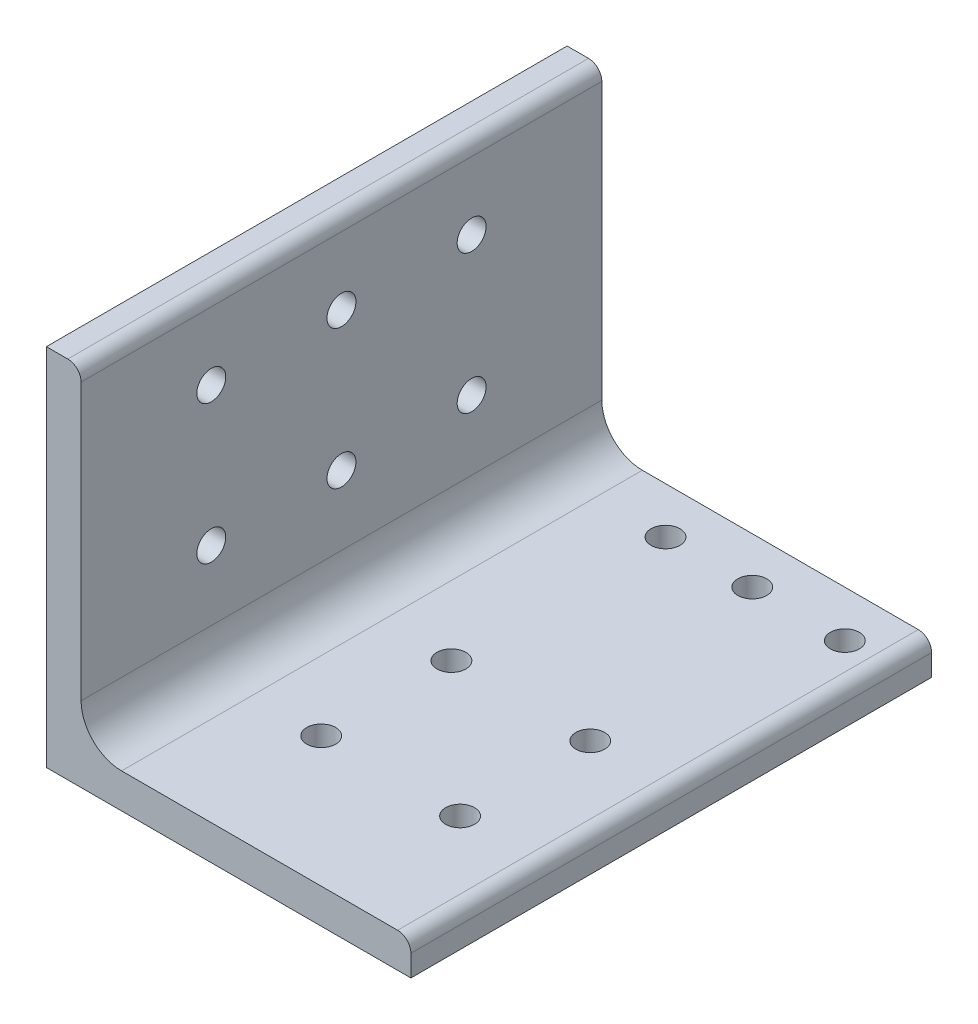
ISO-10303-21;
HEADER;
FILE_DESCRIPTION(('STEP AP214'),'2;1');
FILE_NAME('part.step','',(''),(''),'','','');
FILE_SCHEMA(('AUTOMOTIVE_DESIGN { 1 0 10303 214 1 1 1 1 }'));
ENDSEC;
DATA;
#1=APPLICATION_CONTEXT('core data for automotive mechanical design processes');
#2=APPLICATION_PROTOCOL_DEFINITION('international standard','automotive_design',2000,#1);
#3=PRODUCT_CONTEXT('',#1,'mechanical');
#4=PRODUCT('Part','Part','',(#3));
#5=PRODUCT_RELATED_PRODUCT_CATEGORY('part','',(#4));
#6=PRODUCT_DEFINITION_FORMATION('','',#4);
#7=PRODUCT_DEFINITION_CONTEXT('part definition',#1,'design');
#8=PRODUCT_DEFINITION('design','',#6,#7);
#9=PRODUCT_DEFINITION_SHAPE('','',#8);
#10=(LENGTH_UNIT() NAMED_UNIT(*) SI_UNIT(.MILLI.,.METRE.));
#11=(NAMED_UNIT(*) PLANE_ANGLE_UNIT() SI_UNIT($,.RADIAN.));
#12=(NAMED_UNIT(*) SI_UNIT($,.STERADIAN.) SOLID_ANGLE_UNIT());
#13=UNCERTAINTY_MEASURE_WITH_UNIT(LENGTH_MEASURE(1.E-05),#10,'distance_accuracy_value','');
#14=(GEOMETRIC_REPRESENTATION_CONTEXT(3) GLOBAL_UNCERTAINTY_ASSIGNED_CONTEXT((#13)) GLOBAL_UNIT_ASSIGNED_CONTEXT((#10,
#11,#12)) REPRESENTATION_CONTEXT('',''));
#15=CARTESIAN_POINT('',(0.,0.,0.));
#16=DIRECTION('',(0.,0.,1.));
#17=DIRECTION('',(1.,0.,0.));
#18=AXIS2_PLACEMENT_3D('',#15,#16,#17);
#19=CARTESIAN_POINT('',(0.,0.,90.));
#20=DIRECTION('',(-1.,0.,0.));
#21=DIRECTION('',(0.,0.,1.));
#22=AXIS2_PLACEMENT_3D('',#19,#20,#21);
#23=PLANE('',#22);
#24=CARTESIAN_POINT('',(0.,25.,67.5));
#25=DIRECTION('',(1.,0.,0.));
#26=DIRECTION('',(0.,0.,-1.));
#27=AXIS2_PLACEMENT_3D('',#24,#25,#26);
#28=CIRCLE('',#27,2.5);
#29=CARTESIAN_POINT('',(0.,25.,65.));
#30=VERTEX_POINT('',#29);
#31=EDGE_CURVE('E295',#30,#30,#28,.T.);
#32=ORIENTED_EDGE('',*,*,#31,.T.);
#33=EDGE_LOOP('',(#32));
#34=FACE_BOUND('',#33,.T.);
#35=CARTESIAN_POINT('',(0.,49.,45.));
#36=DIRECTION('',(1.,0.,0.));
#37=DIRECTION('',(0.,0.,-1.));
#38=AXIS2_PLACEMENT_3D('',#35,#36,#37);
#39=CIRCLE('',#38,2.5);
#40=CARTESIAN_POINT('',(0.,49.,42.5));
#41=VERTEX_POINT('',#40);
#42=EDGE_CURVE('E307',#41,#41,#39,.T.);
#43=ORIENTED_EDGE('',*,*,#42,.T.);
#44=EDGE_LOOP('',(#43));
#45=FACE_BOUND('',#44,.T.);
#46=CARTESIAN_POINT('',(0.,25.,45.));
#47=DIRECTION('',(1.,0.,0.));
#48=DIRECTION('',(0.,0.,-1.));
#49=AXIS2_PLACEMENT_3D('',#46,#47,#48);
#50=CIRCLE('',#49,2.5);
#51=CARTESIAN_POINT('',(0.,25.,42.5));
#52=VERTEX_POINT('',#51);
#53=EDGE_CURVE('E311',#52,#52,#50,.T.);
#54=ORIENTED_EDGE('',*,*,#53,.T.);
#55=EDGE_LOOP('',(#54));
#56=FACE_BOUND('',#55,.T.);
#57=CARTESIAN_POINT('',(0.,25.,22.5));
#58=DIRECTION('',(1.,0.,0.));
#59=DIRECTION('',(0.,0.,-1.));
#60=AXIS2_PLACEMENT_3D('',#57,#58,#59);
#61=CIRCLE('',#60,2.5);
#62=CARTESIAN_POINT('',(0.,25.,20.));
#63=VERTEX_POINT('',#62);
#64=EDGE_CURVE('E238',#63,#63,#61,.T.);
#65=ORIENTED_EDGE('',*,*,#64,.T.);
#66=EDGE_LOOP('',(#65));
#67=FACE_BOUND('',#66,.T.);
#68=CARTESIAN_POINT('',(0.,49.,22.5000000000001));
#69=DIRECTION('',(1.,0.,0.));
#70=DIRECTION('',(0.,0.,-1.));
#71=AXIS2_PLACEMENT_3D('',#68,#69,#70);
#72=CIRCLE('',#71,2.5);
#73=CARTESIAN_POINT('',(0.,49.,20.0000000000001));
#74=VERTEX_POINT('',#73);
#75=EDGE_CURVE('E136',#74,#74,#72,.T.);
#76=ORIENTED_EDGE('',*,*,#75,.T.);
#77=EDGE_LOOP('',(#76));
#78=FACE_BOUND('',#77,.T.);
#79=DIRECTION('',(0.,1.,0.));
#80=VECTOR('',#79,1.);
#81=CARTESIAN_POINT('',(0.,0.,0.));
#82=LINE('',#81,#80);
#83=CARTESIAN_POINT('',(0.,0.,0.));
#84=VERTEX_POINT('',#83);
#85=CARTESIAN_POINT('',(0.,63.,0.));
#86=VERTEX_POINT('',#85);
#87=EDGE_CURVE('E145',#84,#86,#82,.T.);
#88=ORIENTED_EDGE('',*,*,#87,.F.);
#89=DIRECTION('',(0.,0.,-1.));
#90=VECTOR('',#89,1.);
#91=CARTESIAN_POINT('',(0.,0.,90.));
#92=LINE('',#91,#90);
#93=CARTESIAN_POINT('',(0.,0.,90.));
#94=VERTEX_POINT('',#93);
#95=EDGE_CURVE('E160',#94,#84,#92,.T.);
#96=ORIENTED_EDGE('',*,*,#95,.F.);
#97=DIRECTION('',(0.,1.,0.));
#98=VECTOR('',#97,1.);
#99=CARTESIAN_POINT('',(0.,0.,90.));
#100=LINE('',#99,#98);
#101=CARTESIAN_POINT('',(0.,63.,90.));
#102=VERTEX_POINT('',#101);
#103=EDGE_CURVE('E252',#94,#102,#100,.T.);
#104=ORIENTED_EDGE('',*,*,#103,.T.);
#105=DIRECTION('',(0.,0.,-1.));
#106=VECTOR('',#105,1.);
#107=CARTESIAN_POINT('',(0.,63.,90.));
#108=LINE('',#107,#106);
#109=EDGE_CURVE('E162',#102,#86,#108,.T.);
#110=ORIENTED_EDGE('',*,*,#109,.T.);
#111=EDGE_LOOP('',(#88,#96,#104,#110));
#112=FACE_BOUND('',#111,.T.);
#113=CARTESIAN_POINT('',(0.,49.,67.5));
#114=DIRECTION('',(1.,0.,0.));
#115=DIRECTION('',(0.,0.,-1.));
#116=AXIS2_PLACEMENT_3D('',#113,#114,#115);
#117=CIRCLE('',#116,2.5);
#118=CARTESIAN_POINT('',(0.,49.,65.));
#119=VERTEX_POINT('',#118);
#120=EDGE_CURVE('E303',#119,#119,#117,.T.);
#121=ORIENTED_EDGE('',*,*,#120,.T.);
#122=EDGE_LOOP('',(#121));
#123=FACE_BOUND('',#122,.T.);
#124=ADVANCED_FACE('F32',(#34,#45,#56,#67,#78,#112,#123),#23,.T.);
#125=CARTESIAN_POINT('',(13.,13.,90.));
#126=DIRECTION('',(0.,0.,-1.));
#127=DIRECTION('',(-1.,0.,0.));
#128=AXIS2_PLACEMENT_3D('',#125,#126,#127);
#129=CYLINDRICAL_SURFACE('',#128,7.);
#130=CARTESIAN_POINT('',(13.,13.,0.));
#131=DIRECTION('',(0.,0.,1.));
#132=DIRECTION('',(1.,0.,0.));
#133=AXIS2_PLACEMENT_3D('',#130,#131,#132);
#134=CIRCLE('',#133,7.);
#135=CARTESIAN_POINT('',(6.,13.,0.));
#136=VERTEX_POINT('',#135);
#137=CARTESIAN_POINT('',(13.,6.,0.));
#138=VERTEX_POINT('',#137);
#139=EDGE_CURVE('E133',#136,#138,#134,.T.);
#140=ORIENTED_EDGE('',*,*,#139,.F.);
#141=DIRECTION('',(0.,0.,-1.));
#142=VECTOR('',#141,1.);
#143=CARTESIAN_POINT('',(6.,13.,90.));
#144=LINE('',#143,#142);
#145=CARTESIAN_POINT('',(6.,13.,90.));
#146=VERTEX_POINT('',#145);
#147=EDGE_CURVE('E11',#146,#136,#144,.T.);
#148=ORIENTED_EDGE('',*,*,#147,.F.);
#149=CARTESIAN_POINT('',(13.,13.,90.));
#150=DIRECTION('',(0.,0.,1.));
#151=DIRECTION('',(1.,0.,0.));
#152=AXIS2_PLACEMENT_3D('',#149,#150,#151);
#153=CIRCLE('',#152,7.);
#154=CARTESIAN_POINT('',(13.,6.,90.));
#155=VERTEX_POINT('',#154);
#156=EDGE_CURVE('E156',#146,#155,#153,.T.);
#157=ORIENTED_EDGE('',*,*,#156,.T.);
#158=DIRECTION('',(0.,0.,-1.));
#159=VECTOR('',#158,1.);
#160=CARTESIAN_POINT('',(13.,6.,90.));
#161=LINE('',#160,#159);
#162=EDGE_CURVE('E49',#155,#138,#161,.T.);
#163=ORIENTED_EDGE('',*,*,#162,.T.);
#164=EDGE_LOOP('',(#140,#148,#157,#163));
#165=FACE_BOUND('',#164,.T.);
#166=ADVANCED_FACE('F34',(#165),#129,.F.);
#167=CARTESIAN_POINT('',(6.,0.,90.));
#168=DIRECTION('',(1.,0.,0.));
#169=DIRECTION('',(0.,1.,0.));
#170=AXIS2_PLACEMENT_3D('',#167,#168,#169);
#171=PLANE('',#170);
#172=CARTESIAN_POINT('',(6.,25.,67.5));
#173=DIRECTION('',(1.,0.,0.));
#174=DIRECTION('',(0.,0.,-1.));
#175=AXIS2_PLACEMENT_3D('',#172,#173,#174);
#176=CIRCLE('',#175,2.5);
#177=CARTESIAN_POINT('',(6.,25.,65.));
#178=VERTEX_POINT('',#177);
#179=EDGE_CURVE('E217',#178,#178,#176,.T.);
#180=ORIENTED_EDGE('',*,*,#179,.F.);
#181=EDGE_LOOP('',(#180));
#182=FACE_BOUND('',#181,.T.);
#183=CARTESIAN_POINT('',(6.,49.,67.5));
#184=DIRECTION('',(1.,0.,0.));
#185=DIRECTION('',(0.,0.,-1.));
#186=AXIS2_PLACEMENT_3D('',#183,#184,#185);
#187=CIRCLE('',#186,2.5);
#188=CARTESIAN_POINT('',(6.,49.,65.));
#189=VERTEX_POINT('',#188);
#190=EDGE_CURVE('E221',#189,#189,#187,.T.);
#191=ORIENTED_EDGE('',*,*,#190,.F.);
#192=EDGE_LOOP('',(#191));
#193=FACE_BOUND('',#192,.T.);
#194=CARTESIAN_POINT('',(6.,49.,45.));
#195=DIRECTION('',(1.,0.,0.));
#196=DIRECTION('',(0.,0.,-1.));
#197=AXIS2_PLACEMENT_3D('',#194,#195,#196);
#198=CIRCLE('',#197,2.5);
#199=CARTESIAN_POINT('',(6.,49.,42.5));
#200=VERTEX_POINT('',#199);
#201=EDGE_CURVE('E225',#200,#200,#198,.T.);
#202=ORIENTED_EDGE('',*,*,#201,.F.);
#203=EDGE_LOOP('',(#202));
#204=FACE_BOUND('',#203,.T.);
#205=CARTESIAN_POINT('',(6.,25.,45.));
#206=DIRECTION('',(1.,0.,0.));
#207=DIRECTION('',(0.,0.,-1.));
#208=AXIS2_PLACEMENT_3D('',#205,#206,#207);
#209=CIRCLE('',#208,2.5);
#210=CARTESIAN_POINT('',(6.,25.,42.5));
#211=VERTEX_POINT('',#210);
#212=EDGE_CURVE('E229',#211,#211,#209,.T.);
#213=ORIENTED_EDGE('',*,*,#212,.F.);
#214=EDGE_LOOP('',(#213));
#215=FACE_BOUND('',#214,.T.);
#216=CARTESIAN_POINT('',(6.,25.,22.5));
#217=DIRECTION('',(1.,0.,0.));
#218=DIRECTION('',(0.,0.,-1.));
#219=AXIS2_PLACEMENT_3D('',#216,#217,#218);
#220=CIRCLE('',#219,2.5);
#221=CARTESIAN_POINT('',(6.,25.,20.));
#222=VERTEX_POINT('',#221);
#223=EDGE_CURVE('E233',#222,#222,#220,.T.);
#224=ORIENTED_EDGE('',*,*,#223,.F.);
#225=EDGE_LOOP('',(#224));
#226=FACE_BOUND('',#225,.T.);
#227=CARTESIAN_POINT('',(6.,49.,22.5000000000001));
#228=DIRECTION('',(1.,0.,0.));
#229=DIRECTION('',(0.,0.,-1.));
#230=AXIS2_PLACEMENT_3D('',#227,#228,#229);
#231=CIRCLE('',#230,2.5);
#232=CARTESIAN_POINT('',(6.,49.,20.0000000000001));
#233=VERTEX_POINT('',#232);
#234=EDGE_CURVE('E236',#233,#233,#231,.T.);
#235=ORIENTED_EDGE('',*,*,#234,.F.);
#236=EDGE_LOOP('',(#235));
#237=FACE_BOUND('',#236,.T.);
#238=DIRECTION('',(0.,-1.,0.));
#239=VECTOR('',#238,1.);
#240=CARTESIAN_POINT('',(6.,0.,0.));
#241=LINE('',#240,#239);
#242=CARTESIAN_POINT('',(6.,60.7,0.));
#243=VERTEX_POINT('',#242);
#244=EDGE_CURVE('E135',#243,#136,#241,.T.);
#245=ORIENTED_EDGE('',*,*,#244,.F.);
#246=DIRECTION('',(0.,0.,-1.));
#247=VECTOR('',#246,1.);
#248=CARTESIAN_POINT('',(6.,60.7,90.));
#249=LINE('',#248,#247);
#250=CARTESIAN_POINT('',(6.,60.7,90.));
#251=VERTEX_POINT('',#250);
#252=EDGE_CURVE('E41',#251,#243,#249,.T.);
#253=ORIENTED_EDGE('',*,*,#252,.F.);
#254=DIRECTION('',(0.,-1.,0.));
#255=VECTOR('',#254,1.);
#256=CARTESIAN_POINT('',(6.,0.,90.));
#257=LINE('',#256,#255);
#258=EDGE_CURVE('E179',#251,#146,#257,.T.);
#259=ORIENTED_EDGE('',*,*,#258,.T.);
#260=ORIENTED_EDGE('',*,*,#147,.T.);
#261=EDGE_LOOP('',(#245,#253,#259,#260));
#262=FACE_BOUND('',#261,.T.);
#263=ADVANCED_FACE('F178',(#182,#193,#204,#215,#226,#237,#262),#171,.T.);
#264=CARTESIAN_POINT('',(3.7,60.7,90.));
#265=DIRECTION('',(0.,0.,-1.));
#266=DIRECTION('',(-1.,0.,0.));
#267=AXIS2_PLACEMENT_3D('',#264,#265,#266);
#268=CYLINDRICAL_SURFACE('',#267,2.3);
#269=CARTESIAN_POINT('',(3.7,60.7,0.));
#270=DIRECTION('',(0.,0.,1.));
#271=DIRECTION('',(1.,0.,0.));
#272=AXIS2_PLACEMENT_3D('',#269,#270,#271);
#273=CIRCLE('',#272,2.3);
#274=CARTESIAN_POINT('',(3.69999999999999,63.,0.));
#275=VERTEX_POINT('',#274);
#276=EDGE_CURVE('E139',#243,#275,#273,.T.);
#277=ORIENTED_EDGE('',*,*,#276,.T.);
#278=DIRECTION('',(0.,0.,-1.));
#279=VECTOR('',#278,1.);
#280=CARTESIAN_POINT('',(3.69999999999999,63.,90.));
#281=LINE('',#280,#279);
#282=CARTESIAN_POINT('',(3.69999999999999,63.,90.));
#283=VERTEX_POINT('',#282);
#284=EDGE_CURVE('E164',#283,#275,#281,.T.);
#285=ORIENTED_EDGE('',*,*,#284,.F.);
#286=CARTESIAN_POINT('',(3.7,60.7,90.));
#287=DIRECTION('',(0.,0.,1.));
#288=DIRECTION('',(1.,0.,0.));
#289=AXIS2_PLACEMENT_3D('',#286,#287,#288);
#290=CIRCLE('',#289,2.3);
#291=EDGE_CURVE('E170',#251,#283,#290,.T.);
#292=ORIENTED_EDGE('',*,*,#291,.F.);
#293=ORIENTED_EDGE('',*,*,#252,.T.);
#294=EDGE_LOOP('',(#277,#285,#292,#293));
#295=FACE_BOUND('',#294,.T.);
#296=ADVANCED_FACE('F168',(#295),#268,.T.);
#297=CARTESIAN_POINT('',(0.,63.,90.));
#298=DIRECTION('',(0.,1.,0.));
#299=DIRECTION('',(0.,0.,1.));
#300=AXIS2_PLACEMENT_3D('',#297,#298,#299);
#301=PLANE('',#300);
#302=DIRECTION('',(1.,0.,0.));
#303=VECTOR('',#302,1.);
#304=CARTESIAN_POINT('',(0.,63.,0.));
#305=LINE('',#304,#303);
#306=EDGE_CURVE('E142',#86,#275,#305,.T.);
#307=ORIENTED_EDGE('',*,*,#306,.F.);
#308=ORIENTED_EDGE('',*,*,#109,.F.);
#309=DIRECTION('',(1.,0.,0.));
#310=VECTOR('',#309,1.);
#311=CARTESIAN_POINT('',(0.,63.,90.));
#312=LINE('',#311,#310);
#313=EDGE_CURVE('E249',#102,#283,#312,.T.);
#314=ORIENTED_EDGE('',*,*,#313,.T.);
#315=ORIENTED_EDGE('',*,*,#284,.T.);
#316=EDGE_LOOP('',(#307,#308,#314,#315));
#317=FACE_BOUND('',#316,.T.);
#318=ADVANCED_FACE('F205',(#317),#301,.T.);
#319=CARTESIAN_POINT('',(0.,0.,90.));
#320=DIRECTION('',(0.,1.,0.));
#321=DIRECTION('',(0.,0.,1.));
#322=AXIS2_PLACEMENT_3D('',#319,#320,#321);
#323=PLANE('',#322);
#324=CARTESIAN_POINT('',(49.,0.,67.5));
#325=DIRECTION('',(0.,1.,0.));
#326=DIRECTION('',(0.,0.,1.));
#327=AXIS2_PLACEMENT_3D('',#324,#325,#326);
#328=CIRCLE('',#327,2.5);
#329=CARTESIAN_POINT('',(49.,0.,70.));
#330=VERTEX_POINT('',#329);
#331=EDGE_CURVE('E268',#330,#330,#328,.T.);
#332=ORIENTED_EDGE('',*,*,#331,.T.);
#333=EDGE_LOOP('',(#332));
#334=FACE_BOUND('',#333,.T.);
#335=CARTESIAN_POINT('',(49.,0.,45.));
#336=DIRECTION('',(0.,1.,0.));
#337=DIRECTION('',(0.,0.,1.));
#338=AXIS2_PLACEMENT_3D('',#335,#336,#337);
#339=CIRCLE('',#338,2.5);
#340=CARTESIAN_POINT('',(49.,0.,47.5));
#341=VERTEX_POINT('',#340);
#342=EDGE_CURVE('E272',#341,#341,#339,.T.);
#343=ORIENTED_EDGE('',*,*,#342,.T.);
#344=EDGE_LOOP('',(#343));
#345=FACE_BOUND('',#344,.T.);
#346=CARTESIAN_POINT('',(25.,0.,45.));
#347=DIRECTION('',(0.,1.,0.));
#348=DIRECTION('',(0.,0.,1.));
#349=AXIS2_PLACEMENT_3D('',#346,#347,#348);
#350=CIRCLE('',#349,2.5);
#351=CARTESIAN_POINT('',(25.,0.,47.5));
#352=VERTEX_POINT('',#351);
#353=EDGE_CURVE('E276',#352,#352,#350,.T.);
#354=ORIENTED_EDGE('',*,*,#353,.T.);
#355=EDGE_LOOP('',(#354));
#356=FACE_BOUND('',#355,.T.);
#357=CARTESIAN_POINT('',(25.,0.,67.5));
#358=DIRECTION('',(0.,1.,0.));
#359=DIRECTION('',(0.,0.,1.));
#360=AXIS2_PLACEMENT_3D('',#357,#358,#359);
#361=CIRCLE('',#360,2.5);
#362=CARTESIAN_POINT('',(25.,0.,70.));
#363=VERTEX_POINT('',#362);
#364=EDGE_CURVE('E280',#363,#363,#361,.T.);
#365=ORIENTED_EDGE('',*,*,#364,.T.);
#366=EDGE_LOOP('',(#365));
#367=FACE_BOUND('',#366,.T.);
#368=CARTESIAN_POINT('',(25.,0.,8.));
#369=DIRECTION('',(0.,1.,0.));
#370=DIRECTION('',(0.,0.,1.));
#371=AXIS2_PLACEMENT_3D('',#368,#369,#370);
#372=CIRCLE('',#371,2.5);
#373=CARTESIAN_POINT('',(25.,0.,10.5));
#374=VERTEX_POINT('',#373);
#375=EDGE_CURVE('E284',#374,#374,#372,.T.);
#376=ORIENTED_EDGE('',*,*,#375,.T.);
#377=EDGE_LOOP('',(#376));
#378=FACE_BOUND('',#377,.T.);
#379=CARTESIAN_POINT('',(40.,0.,8.));
#380=DIRECTION('',(0.,1.,0.));
#381=DIRECTION('',(0.,0.,1.));
#382=AXIS2_PLACEMENT_3D('',#379,#380,#381);
#383=CIRCLE('',#382,2.5);
#384=CARTESIAN_POINT('',(40.,0.,10.5));
#385=VERTEX_POINT('',#384);
#386=EDGE_CURVE('E288',#385,#385,#383,.T.);
#387=ORIENTED_EDGE('',*,*,#386,.T.);
#388=EDGE_LOOP('',(#387));
#389=FACE_BOUND('',#388,.T.);
#390=CARTESIAN_POINT('',(56.,0.,8.));
#391=DIRECTION('',(0.,1.,0.));
#392=DIRECTION('',(0.,0.,1.));
#393=AXIS2_PLACEMENT_3D('',#390,#391,#392);
#394=CIRCLE('',#393,2.5);
#395=CARTESIAN_POINT('',(56.,0.,10.5));
#396=VERTEX_POINT('',#395);
#397=EDGE_CURVE('E291',#396,#396,#394,.T.);
#398=ORIENTED_EDGE('',*,*,#397,.T.);
#399=EDGE_LOOP('',(#398));
#400=FACE_BOUND('',#399,.T.);
#401=DIRECTION('',(1.,0.,0.));
#402=VECTOR('',#401,1.);
#403=CARTESIAN_POINT('',(0.,0.,0.));
#404=LINE('',#403,#402);
#405=CARTESIAN_POINT('',(63.,0.,0.));
#406=VERTEX_POINT('',#405);
#407=EDGE_CURVE('E148',#84,#406,#404,.T.);
#408=ORIENTED_EDGE('',*,*,#407,.T.);
#409=DIRECTION('',(0.,0.,-1.));
#410=VECTOR('',#409,1.);
#411=CARTESIAN_POINT('',(63.,0.,90.));
#412=LINE('',#411,#410);
#413=CARTESIAN_POINT('',(63.,0.,90.));
#414=VERTEX_POINT('',#413);
#415=EDGE_CURVE('E125',#414,#406,#412,.T.);
#416=ORIENTED_EDGE('',*,*,#415,.F.);
#417=DIRECTION('',(1.,0.,0.));
#418=VECTOR('',#417,1.);
#419=CARTESIAN_POINT('',(0.,0.,90.));
#420=LINE('',#419,#418);
#421=EDGE_CURVE('E113',#94,#414,#420,.T.);
#422=ORIENTED_EDGE('',*,*,#421,.F.);
#423=ORIENTED_EDGE('',*,*,#95,.T.);
#424=EDGE_LOOP('',(#408,#416,#422,#423));
#425=FACE_BOUND('',#424,.T.);
#426=ADVANCED_FACE('F203',(#334,#345,#356,#367,#378,#389,#400,#425),#323,.F.);
#427=CARTESIAN_POINT('',(63.,0.,90.));
#428=DIRECTION('',(-1.,0.,0.));
#429=DIRECTION('',(0.,0.,1.));
#430=AXIS2_PLACEMENT_3D('',#427,#428,#429);
#431=PLANE('',#430);
#432=DIRECTION('',(0.,1.,0.));
#433=VECTOR('',#432,1.);
#434=CARTESIAN_POINT('',(63.,0.,0.));
#435=LINE('',#434,#433);
#436=CARTESIAN_POINT('',(63.,3.69999999999998,0.));
#437=VERTEX_POINT('',#436);
#438=EDGE_CURVE('E122',#406,#437,#435,.T.);
#439=ORIENTED_EDGE('',*,*,#438,.T.);
#440=DIRECTION('',(0.,0.,-1.));
#441=VECTOR('',#440,1.);
#442=CARTESIAN_POINT('',(63.,3.69999999999998,90.));
#443=LINE('',#442,#441);
#444=CARTESIAN_POINT('',(63.,3.69999999999998,90.));
#445=VERTEX_POINT('',#444);
#446=EDGE_CURVE('E119',#445,#437,#443,.T.);
#447=ORIENTED_EDGE('',*,*,#446,.F.);
#448=DIRECTION('',(0.,1.,0.));
#449=VECTOR('',#448,1.);
#450=CARTESIAN_POINT('',(63.,0.,90.));
#451=LINE('',#450,#449);
#452=EDGE_CURVE('E105',#414,#445,#451,.T.);
#453=ORIENTED_EDGE('',*,*,#452,.F.);
#454=ORIENTED_EDGE('',*,*,#415,.T.);
#455=EDGE_LOOP('',(#439,#447,#453,#454));
#456=FACE_BOUND('',#455,.T.);
#457=ADVANCED_FACE('F120',(#456),#431,.F.);
#458=CARTESIAN_POINT('',(60.7,3.7,90.));
#459=DIRECTION('',(0.,0.,-1.));
#460=DIRECTION('',(-1.,0.,0.));
#461=AXIS2_PLACEMENT_3D('',#458,#459,#460);
#462=CYLINDRICAL_SURFACE('',#461,2.3);
#463=CARTESIAN_POINT('',(60.7,3.7,0.));
#464=DIRECTION('',(0.,0.,1.));
#465=DIRECTION('',(1.,0.,0.));
#466=AXIS2_PLACEMENT_3D('',#463,#464,#465);
#467=CIRCLE('',#466,2.3);
#468=CARTESIAN_POINT('',(60.7,6.,0.));
#469=VERTEX_POINT('',#468);
#470=EDGE_CURVE('E151',#437,#469,#467,.T.);
#471=ORIENTED_EDGE('',*,*,#470,.T.);
#472=DIRECTION('',(0.,0.,-1.));
#473=VECTOR('',#472,1.);
#474=CARTESIAN_POINT('',(60.7,6.,90.));
#475=LINE('',#474,#473);
#476=CARTESIAN_POINT('',(60.7,6.,90.));
#477=VERTEX_POINT('',#476);
#478=EDGE_CURVE('E78',#477,#469,#475,.T.);
#479=ORIENTED_EDGE('',*,*,#478,.F.);
#480=CARTESIAN_POINT('',(60.7,3.7,90.));
#481=DIRECTION('',(0.,0.,1.));
#482=DIRECTION('',(1.,0.,0.));
#483=AXIS2_PLACEMENT_3D('',#480,#481,#482);
#484=CIRCLE('',#483,2.3);
#485=EDGE_CURVE('E110',#445,#477,#484,.T.);
#486=ORIENTED_EDGE('',*,*,#485,.F.);
#487=ORIENTED_EDGE('',*,*,#446,.T.);
#488=EDGE_LOOP('',(#471,#479,#486,#487));
#489=FACE_BOUND('',#488,.T.);
#490=ADVANCED_FACE('F127',(#489),#462,.T.);
#491=CARTESIAN_POINT('',(0.,6.,90.));
#492=DIRECTION('',(0.,1.,0.));
#493=DIRECTION('',(0.,0.,1.));
#494=AXIS2_PLACEMENT_3D('',#491,#492,#493);
#495=PLANE('',#494);
#496=CARTESIAN_POINT('',(49.,6.,67.5));
#497=DIRECTION('',(0.,1.,0.));
#498=DIRECTION('',(0.,0.,1.));
#499=AXIS2_PLACEMENT_3D('',#496,#497,#498);
#500=CIRCLE('',#499,2.5);
#501=CARTESIAN_POINT('',(49.,6.,70.));
#502=VERTEX_POINT('',#501);
#503=EDGE_CURVE('E468',#502,#502,#500,.T.);
#504=ORIENTED_EDGE('',*,*,#503,.F.);
#505=EDGE_LOOP('',(#504));
#506=FACE_BOUND('',#505,.T.);
#507=CARTESIAN_POINT('',(49.,6.,45.));
#508=DIRECTION('',(0.,1.,0.));
#509=DIRECTION('',(0.,0.,1.));
#510=AXIS2_PLACEMENT_3D('',#507,#508,#509);
#511=CIRCLE('',#510,2.5);
#512=CARTESIAN_POINT('',(49.,6.,47.5));
#513=VERTEX_POINT('',#512);
#514=EDGE_CURVE('E470',#513,#513,#511,.T.);
#515=ORIENTED_EDGE('',*,*,#514,.F.);
#516=EDGE_LOOP('',(#515));
#517=FACE_BOUND('',#516,.T.);
#518=CARTESIAN_POINT('',(25.,6.,45.));
#519=DIRECTION('',(0.,1.,0.));
#520=DIRECTION('',(0.,0.,1.));
#521=AXIS2_PLACEMENT_3D('',#518,#519,#520);
#522=CIRCLE('',#521,2.5);
#523=CARTESIAN_POINT('',(25.,6.,47.5));
#524=VERTEX_POINT('',#523);
#525=EDGE_CURVE('E476',#524,#524,#522,.T.);
#526=ORIENTED_EDGE('',*,*,#525,.F.);
#527=EDGE_LOOP('',(#526));
#528=FACE_BOUND('',#527,.T.);
#529=CARTESIAN_POINT('',(25.,6.,67.5));
#530=DIRECTION('',(0.,1.,0.));
#531=DIRECTION('',(0.,0.,1.));
#532=AXIS2_PLACEMENT_3D('',#529,#530,#531);
#533=CIRCLE('',#532,2.5);
#534=CARTESIAN_POINT('',(25.,6.,70.));
#535=VERTEX_POINT('',#534);
#536=EDGE_CURVE('E480',#535,#535,#533,.T.);
#537=ORIENTED_EDGE('',*,*,#536,.F.);
#538=EDGE_LOOP('',(#537));
#539=FACE_BOUND('',#538,.T.);
#540=CARTESIAN_POINT('',(25.,6.,8.));
#541=DIRECTION('',(0.,1.,0.));
#542=DIRECTION('',(0.,0.,1.));
#543=AXIS2_PLACEMENT_3D('',#540,#541,#542);
#544=CIRCLE('',#543,2.5);
#545=CARTESIAN_POINT('',(25.,6.,10.5));
#546=VERTEX_POINT('',#545);
#547=EDGE_CURVE('E484',#546,#546,#544,.T.);
#548=ORIENTED_EDGE('',*,*,#547,.F.);
#549=EDGE_LOOP('',(#548));
#550=FACE_BOUND('',#549,.T.);
#551=CARTESIAN_POINT('',(40.,6.,8.));
#552=DIRECTION('',(0.,1.,0.));
#553=DIRECTION('',(0.,0.,1.));
#554=AXIS2_PLACEMENT_3D('',#551,#552,#553);
#555=CIRCLE('',#554,2.5);
#556=CARTESIAN_POINT('',(40.,6.,10.5));
#557=VERTEX_POINT('',#556);
#558=EDGE_CURVE('E488',#557,#557,#555,.T.);
#559=ORIENTED_EDGE('',*,*,#558,.F.);
#560=EDGE_LOOP('',(#559));
#561=FACE_BOUND('',#560,.T.);
#562=CARTESIAN_POINT('',(56.,6.,8.));
#563=DIRECTION('',(0.,1.,0.));
#564=DIRECTION('',(0.,0.,1.));
#565=AXIS2_PLACEMENT_3D('',#562,#563,#564);
#566=CIRCLE('',#565,2.5);
#567=CARTESIAN_POINT('',(56.,6.,10.5));
#568=VERTEX_POINT('',#567);
#569=EDGE_CURVE('E293',#568,#568,#566,.T.);
#570=ORIENTED_EDGE('',*,*,#569,.F.);
#571=EDGE_LOOP('',(#570));
#572=FACE_BOUND('',#571,.T.);
#573=DIRECTION('',(1.,0.,0.));
#574=VECTOR('',#573,1.);
#575=CARTESIAN_POINT('',(0.,6.,0.));
#576=LINE('',#575,#574);
#577=EDGE_CURVE('E153',#138,#469,#576,.T.);
#578=ORIENTED_EDGE('',*,*,#577,.F.);
#579=ORIENTED_EDGE('',*,*,#162,.F.);
#580=DIRECTION('',(1.,0.,0.));
#581=VECTOR('',#580,1.);
#582=CARTESIAN_POINT('',(0.,6.,90.));
#583=LINE('',#582,#581);
#584=EDGE_CURVE('E128',#155,#477,#583,.T.);
#585=ORIENTED_EDGE('',*,*,#584,.T.);
#586=ORIENTED_EDGE('',*,*,#478,.T.);
#587=EDGE_LOOP('',(#578,#579,#585,#586));
#588=FACE_BOUND('',#587,.T.);
#589=ADVANCED_FACE('F180',(#506,#517,#528,#539,#550,#561,#572,#588),#495,.T.);
#590=CARTESIAN_POINT('',(0.,0.,90.));
#591=DIRECTION('',(0.,0.,1.));
#592=DIRECTION('',(1.,0.,0.));
#593=AXIS2_PLACEMENT_3D('',#590,#591,#592);
#594=PLANE('',#593);
#595=ORIENTED_EDGE('',*,*,#156,.F.);
#596=ORIENTED_EDGE('',*,*,#258,.F.);
#597=ORIENTED_EDGE('',*,*,#291,.T.);
#598=ORIENTED_EDGE('',*,*,#313,.F.);
#599=ORIENTED_EDGE('',*,*,#103,.F.);
#600=ORIENTED_EDGE('',*,*,#421,.T.);
#601=ORIENTED_EDGE('',*,*,#452,.T.);
#602=ORIENTED_EDGE('',*,*,#485,.T.);
#603=ORIENTED_EDGE('',*,*,#584,.F.);
#604=EDGE_LOOP('',(#595,#596,#597,#598,#599,#600,#601,#602,#603));
#605=FACE_BOUND('',#604,.T.);
#606=ADVANCED_FACE('F107',(#605),#594,.T.);
#607=CARTESIAN_POINT('',(0.,0.,0.));
#608=DIRECTION('',(0.,0.,1.));
#609=DIRECTION('',(1.,0.,0.));
#610=AXIS2_PLACEMENT_3D('',#607,#608,#609);
#611=PLANE('',#610);
#612=ORIENTED_EDGE('',*,*,#139,.T.);
#613=ORIENTED_EDGE('',*,*,#577,.T.);
#614=ORIENTED_EDGE('',*,*,#470,.F.);
#615=ORIENTED_EDGE('',*,*,#438,.F.);
#616=ORIENTED_EDGE('',*,*,#407,.F.);
#617=ORIENTED_EDGE('',*,*,#87,.T.);
#618=ORIENTED_EDGE('',*,*,#306,.T.);
#619=ORIENTED_EDGE('',*,*,#276,.F.);
#620=ORIENTED_EDGE('',*,*,#244,.T.);
#621=EDGE_LOOP('',(#612,#613,#614,#615,#616,#617,#618,#619,#620));
#622=FACE_BOUND('',#621,.T.);
#623=ADVANCED_FACE('F176',(#622),#611,.F.);
#624=CARTESIAN_POINT('',(6.,49.,22.5000000000001));
#625=DIRECTION('',(1.,0.,0.));
#626=DIRECTION('',(0.,0.,-1.));
#627=AXIS2_PLACEMENT_3D('',#624,#625,#626);
#628=CYLINDRICAL_SURFACE('',#627,2.5);
#629=ORIENTED_EDGE('',*,*,#75,.F.);
#630=EDGE_LOOP('',(#629));
#631=FACE_BOUND('',#630,.T.);
#632=ORIENTED_EDGE('',*,*,#234,.T.);
#633=EDGE_LOOP('',(#632));
#634=FACE_BOUND('',#633,.T.);
#635=ADVANCED_FACE('F317',(#631,#634),#628,.F.);
#636=CARTESIAN_POINT('',(6.,25.,22.5));
#637=DIRECTION('',(1.,0.,0.));
#638=DIRECTION('',(0.,0.,-1.));
#639=AXIS2_PLACEMENT_3D('',#636,#637,#638);
#640=CYLINDRICAL_SURFACE('',#639,2.5);
#641=ORIENTED_EDGE('',*,*,#64,.F.);
#642=EDGE_LOOP('',(#641));
#643=FACE_BOUND('',#642,.T.);
#644=ORIENTED_EDGE('',*,*,#223,.T.);
#645=EDGE_LOOP('',(#644));
#646=FACE_BOUND('',#645,.T.);
#647=ADVANCED_FACE('F314',(#643,#646),#640,.F.);
#648=CARTESIAN_POINT('',(6.,25.,45.));
#649=DIRECTION('',(1.,0.,0.));
#650=DIRECTION('',(0.,0.,-1.));
#651=AXIS2_PLACEMENT_3D('',#648,#649,#650);
#652=CYLINDRICAL_SURFACE('',#651,2.5);
#653=ORIENTED_EDGE('',*,*,#53,.F.);
#654=EDGE_LOOP('',(#653));
#655=FACE_BOUND('',#654,.T.);
#656=ORIENTED_EDGE('',*,*,#212,.T.);
#657=EDGE_LOOP('',(#656));
#658=FACE_BOUND('',#657,.T.);
#659=ADVANCED_FACE('F316',(#655,#658),#652,.F.);
#660=CARTESIAN_POINT('',(6.,49.,45.));
#661=DIRECTION('',(1.,0.,0.));
#662=DIRECTION('',(0.,0.,-1.));
#663=AXIS2_PLACEMENT_3D('',#660,#661,#662);
#664=CYLINDRICAL_SURFACE('',#663,2.5);
#665=ORIENTED_EDGE('',*,*,#42,.F.);
#666=EDGE_LOOP('',(#665));
#667=FACE_BOUND('',#666,.T.);
#668=ORIENTED_EDGE('',*,*,#201,.T.);
#669=EDGE_LOOP('',(#668));
#670=FACE_BOUND('',#669,.T.);
#671=ADVANCED_FACE('F324',(#667,#670),#664,.F.);
#672=CARTESIAN_POINT('',(6.,49.,67.5));
#673=DIRECTION('',(1.,0.,0.));
#674=DIRECTION('',(0.,0.,-1.));
#675=AXIS2_PLACEMENT_3D('',#672,#673,#674);
#676=CYLINDRICAL_SURFACE('',#675,2.5);
#677=ORIENTED_EDGE('',*,*,#120,.F.);
#678=EDGE_LOOP('',(#677));
#679=FACE_BOUND('',#678,.T.);
#680=ORIENTED_EDGE('',*,*,#190,.T.);
#681=EDGE_LOOP('',(#680));
#682=FACE_BOUND('',#681,.T.);
#683=ADVANCED_FACE('F362',(#679,#682),#676,.F.);
#684=CARTESIAN_POINT('',(6.,25.,67.5));
#685=DIRECTION('',(1.,0.,0.));
#686=DIRECTION('',(0.,0.,-1.));
#687=AXIS2_PLACEMENT_3D('',#684,#685,#686);
#688=CYLINDRICAL_SURFACE('',#687,2.5);
#689=ORIENTED_EDGE('',*,*,#31,.F.);
#690=EDGE_LOOP('',(#689));
#691=FACE_BOUND('',#690,.T.);
#692=ORIENTED_EDGE('',*,*,#179,.T.);
#693=EDGE_LOOP('',(#692));
#694=FACE_BOUND('',#693,.T.);
#695=ADVANCED_FACE('F371',(#691,#694),#688,.F.);
#696=CARTESIAN_POINT('',(56.,6.,8.));
#697=DIRECTION('',(0.,1.,0.));
#698=DIRECTION('',(0.,0.,1.));
#699=AXIS2_PLACEMENT_3D('',#696,#697,#698);
#700=CYLINDRICAL_SURFACE('',#699,2.5);
#701=ORIENTED_EDGE('',*,*,#397,.F.);
#702=EDGE_LOOP('',(#701));
#703=FACE_BOUND('',#702,.T.);
#704=ORIENTED_EDGE('',*,*,#569,.T.);
#705=EDGE_LOOP('',(#704));
#706=FACE_BOUND('',#705,.T.);
#707=ADVANCED_FACE('F380',(#703,#706),#700,.F.);
#708=CARTESIAN_POINT('',(40.,6.,8.));
#709=DIRECTION('',(0.,1.,0.));
#710=DIRECTION('',(0.,0.,1.));
#711=AXIS2_PLACEMENT_3D('',#708,#709,#710);
#712=CYLINDRICAL_SURFACE('',#711,2.5);
#713=ORIENTED_EDGE('',*,*,#386,.F.);
#714=EDGE_LOOP('',(#713));
#715=FACE_BOUND('',#714,.T.);
#716=ORIENTED_EDGE('',*,*,#558,.T.);
#717=EDGE_LOOP('',(#716));
#718=FACE_BOUND('',#717,.T.);
#719=ADVANCED_FACE('F403',(#715,#718),#712,.F.);
#720=CARTESIAN_POINT('',(25.,6.,8.));
#721=DIRECTION('',(0.,1.,0.));
#722=DIRECTION('',(0.,0.,1.));
#723=AXIS2_PLACEMENT_3D('',#720,#721,#722);
#724=CYLINDRICAL_SURFACE('',#723,2.5);
#725=ORIENTED_EDGE('',*,*,#375,.F.);
#726=EDGE_LOOP('',(#725));
#727=FACE_BOUND('',#726,.T.);
#728=ORIENTED_EDGE('',*,*,#547,.T.);
#729=EDGE_LOOP('',(#728));
#730=FACE_BOUND('',#729,.T.);
#731=ADVANCED_FACE('F412',(#727,#730),#724,.F.);
#732=CARTESIAN_POINT('',(25.,6.,67.5));
#733=DIRECTION('',(0.,1.,0.));
#734=DIRECTION('',(0.,0.,1.));
#735=AXIS2_PLACEMENT_3D('',#732,#733,#734);
#736=CYLINDRICAL_SURFACE('',#735,2.5);
#737=ORIENTED_EDGE('',*,*,#364,.F.);
#738=EDGE_LOOP('',(#737));
#739=FACE_BOUND('',#738,.T.);
#740=ORIENTED_EDGE('',*,*,#536,.T.);
#741=EDGE_LOOP('',(#740));
#742=FACE_BOUND('',#741,.T.);
#743=ADVANCED_FACE('F422',(#739,#742),#736,.F.);
#744=CARTESIAN_POINT('',(25.,6.,45.));
#745=DIRECTION('',(0.,1.,0.));
#746=DIRECTION('',(0.,0.,1.));
#747=AXIS2_PLACEMENT_3D('',#744,#745,#746);
#748=CYLINDRICAL_SURFACE('',#747,2.5);
#749=ORIENTED_EDGE('',*,*,#353,.F.);
#750=EDGE_LOOP('',(#749));
#751=FACE_BOUND('',#750,.T.);
#752=ORIENTED_EDGE('',*,*,#525,.T.);
#753=EDGE_LOOP('',(#752));
#754=FACE_BOUND('',#753,.T.);
#755=ADVANCED_FACE('F432',(#751,#754),#748,.F.);
#756=CARTESIAN_POINT('',(49.,6.,45.));
#757=DIRECTION('',(0.,1.,0.));
#758=DIRECTION('',(0.,0.,1.));
#759=AXIS2_PLACEMENT_3D('',#756,#757,#758);
#760=CYLINDRICAL_SURFACE('',#759,2.5);
#761=ORIENTED_EDGE('',*,*,#342,.F.);
#762=EDGE_LOOP('',(#761));
#763=FACE_BOUND('',#762,.T.);
#764=ORIENTED_EDGE('',*,*,#514,.T.);
#765=EDGE_LOOP('',(#764));
#766=FACE_BOUND('',#765,.T.);
#767=ADVANCED_FACE('F442',(#763,#766),#760,.F.);
#768=CARTESIAN_POINT('',(49.,6.,67.5));
#769=DIRECTION('',(0.,1.,0.));
#770=DIRECTION('',(0.,0.,1.));
#771=AXIS2_PLACEMENT_3D('',#768,#769,#770);
#772=CYLINDRICAL_SURFACE('',#771,2.5);
#773=ORIENTED_EDGE('',*,*,#331,.F.);
#774=EDGE_LOOP('',(#773));
#775=FACE_BOUND('',#774,.T.);
#776=ORIENTED_EDGE('',*,*,#503,.T.);
#777=EDGE_LOOP('',(#776));
#778=FACE_BOUND('',#777,.T.);
#779=ADVANCED_FACE('F452',(#775,#778),#772,.F.);
#780=CLOSED_SHELL('',(#124,#166,#263,#296,#318,#426,#457,#490,#589,#606,#623,#635,#647,#659,
#671,#683,#695,#707,#719,#731,#743,#755,#767,#779));
#781=MANIFOLD_SOLID_BREP('B2',#780);
#782=ADVANCED_BREP_SHAPE_REPRESENTATION('',(#18,#781),#14);
#783=SHAPE_DEFINITION_REPRESENTATION(#9,#782);
ENDSEC;
END-ISO-10303-21;
